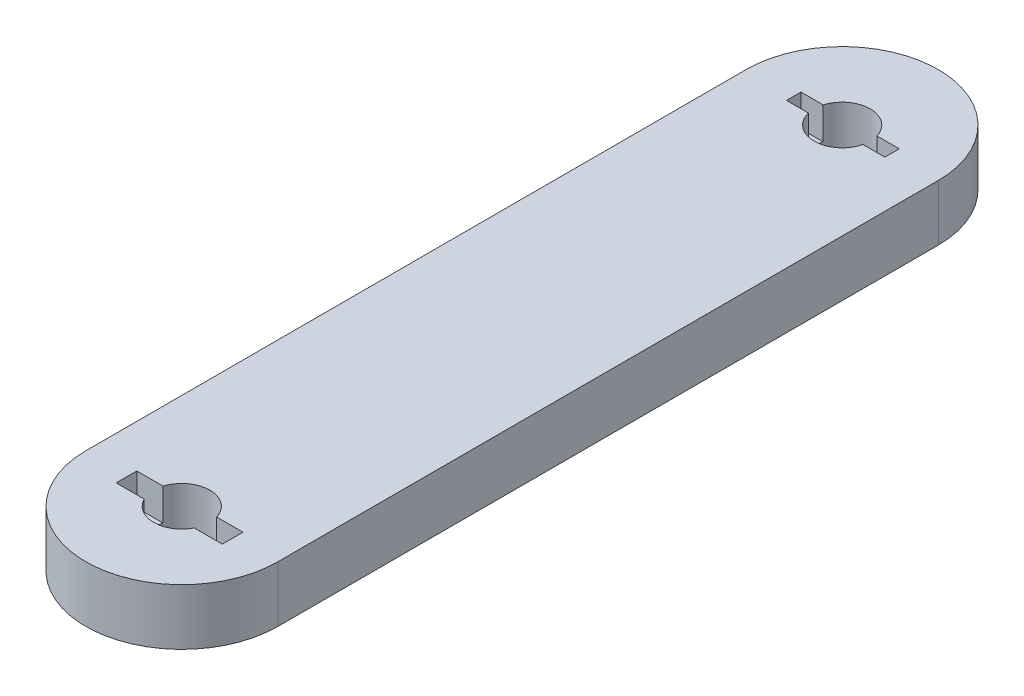
ISO-10303-21;
HEADER;
FILE_DESCRIPTION(('STEP AP214'),'2;1');
FILE_NAME('part.step','',(''),(''),'','','');
FILE_SCHEMA(('AUTOMOTIVE_DESIGN { 1 0 10303 214 1 1 1 1 }'));
ENDSEC;
DATA;
#1=APPLICATION_CONTEXT('core data for automotive mechanical design processes');
#2=APPLICATION_PROTOCOL_DEFINITION('international standard','automotive_design',2000,#1);
#3=PRODUCT_CONTEXT('',#1,'mechanical');
#4=PRODUCT('Part','Part','',(#3));
#5=PRODUCT_RELATED_PRODUCT_CATEGORY('part','',(#4));
#6=PRODUCT_DEFINITION_FORMATION('','',#4);
#7=PRODUCT_DEFINITION_CONTEXT('part definition',#1,'design');
#8=PRODUCT_DEFINITION('design','',#6,#7);
#9=PRODUCT_DEFINITION_SHAPE('','',#8);
#10=(LENGTH_UNIT() NAMED_UNIT(*) SI_UNIT(.MILLI.,.METRE.));
#11=(NAMED_UNIT(*) PLANE_ANGLE_UNIT() SI_UNIT($,.RADIAN.));
#12=(NAMED_UNIT(*) SI_UNIT($,.STERADIAN.) SOLID_ANGLE_UNIT());
#13=UNCERTAINTY_MEASURE_WITH_UNIT(LENGTH_MEASURE(1.E-05),#10,'distance_accuracy_value','');
#14=(GEOMETRIC_REPRESENTATION_CONTEXT(3) GLOBAL_UNCERTAINTY_ASSIGNED_CONTEXT((#13)) GLOBAL_UNIT_ASSIGNED_CONTEXT((#10,
#11,#12)) REPRESENTATION_CONTEXT('',''));
#15=CARTESIAN_POINT('',(0.,0.,0.));
#16=DIRECTION('',(0.,0.,1.));
#17=DIRECTION('',(1.,0.,0.));
#18=AXIS2_PLACEMENT_3D('',#15,#16,#17);
#19=CARTESIAN_POINT('',(0.,7.,-41.25));
#20=DIRECTION('',(0.,1.,0.));
#21=DIRECTION('',(0.,0.,1.));
#22=AXIS2_PLACEMENT_3D('',#19,#20,#21);
#23=PLANE('',#22);
#24=DIRECTION('',(-1.,0.,0.));
#25=VECTOR('',#24,1.);
#26=CARTESIAN_POINT('',(-6.63281125319149,7.,40.2329530805697));
#27=LINE('',#26,#25);
#28=CARTESIAN_POINT('',(-3.3489723145582,7.,40.2329530805697));
#29=VERTEX_POINT('',#28);
#30=CARTESIAN_POINT('',(-6.63281125319149,7.,40.2329530805697));
#31=VERTEX_POINT('',#30);
#32=EDGE_CURVE('E197',#29,#31,#27,.T.);
#33=ORIENTED_EDGE('',*,*,#32,.F.);
#34=CARTESIAN_POINT('',(0.,7.,41.25));
#35=DIRECTION('',(0.,1.,0.));
#36=DIRECTION('',(0.,0.,1.));
#37=AXIS2_PLACEMENT_3D('',#34,#35,#36);
#38=CIRCLE('',#37,3.5);
#39=CARTESIAN_POINT('',(3.34897231455819,7.,40.2329530805697));
#40=VERTEX_POINT('',#39);
#41=EDGE_CURVE('E259',#40,#29,#38,.T.);
#42=ORIENTED_EDGE('',*,*,#41,.F.);
#43=CARTESIAN_POINT('',(6.62393199011865,7.,40.2329530805697));
#44=VERTEX_POINT('',#43);
#45=EDGE_CURVE('E195',#44,#40,#27,.T.);
#46=ORIENTED_EDGE('',*,*,#45,.F.);
#47=DIRECTION('',(0.,0.,-1.));
#48=VECTOR('',#47,1.);
#49=CARTESIAN_POINT('',(6.62393199011865,7.,40.2329530805697));
#50=LINE('',#49,#48);
#51=CARTESIAN_POINT('',(6.62393199011865,7.,42.8139119420991));
#52=VERTEX_POINT('',#51);
#53=EDGE_CURVE('E207',#52,#44,#50,.T.);
#54=ORIENTED_EDGE('',*,*,#53,.F.);
#55=DIRECTION('',(1.,0.,0.));
#56=VECTOR('',#55,1.);
#57=CARTESIAN_POINT('',(-6.63281125319149,7.,42.8139119420991));
#58=LINE('',#57,#56);
#59=CARTESIAN_POINT('',(3.13116263348934,7.,42.8139119420991));
#60=VERTEX_POINT('',#59);
#61=EDGE_CURVE('E203',#60,#52,#58,.T.);
#62=ORIENTED_EDGE('',*,*,#61,.F.);
#63=CARTESIAN_POINT('',(-3.13116263348934,7.,42.8139119420991));
#64=VERTEX_POINT('',#63);
#65=EDGE_CURVE('E256',#64,#60,#38,.T.);
#66=ORIENTED_EDGE('',*,*,#65,.F.);
#67=CARTESIAN_POINT('',(-6.63281125319149,7.,42.8139119420991));
#68=VERTEX_POINT('',#67);
#69=EDGE_CURVE('E205',#68,#64,#58,.T.);
#70=ORIENTED_EDGE('',*,*,#69,.F.);
#71=DIRECTION('',(0.,0.,1.));
#72=VECTOR('',#71,1.);
#73=CARTESIAN_POINT('',(-6.63281125319149,7.,40.2329530805697));
#74=LINE('',#73,#72);
#75=EDGE_CURVE('E179',#31,#68,#74,.T.);
#76=ORIENTED_EDGE('',*,*,#75,.F.);
#77=EDGE_LOOP('',(#33,#42,#46,#54,#62,#66,#70,#76));
#78=FACE_BOUND('',#77,.T.);
#79=DIRECTION('',(-1.,0.,0.));
#80=VECTOR('',#79,1.);
#81=CARTESIAN_POINT('',(-6.13831753886213,7.,-42.2358504559696));
#82=LINE('',#81,#80);
#83=CARTESIAN_POINT('',(-3.35828808747323,7.,-42.2358504559696));
#84=VERTEX_POINT('',#83);
#85=CARTESIAN_POINT('',(-6.13831753886213,7.,-42.2358504559696));
#86=VERTEX_POINT('',#85);
#87=EDGE_CURVE('E231',#84,#86,#82,.T.);
#88=ORIENTED_EDGE('',*,*,#87,.F.);
#89=CARTESIAN_POINT('',(0.,7.,-41.25));
#90=DIRECTION('',(0.,1.,0.));
#91=DIRECTION('',(0.,0.,1.));
#92=AXIS2_PLACEMENT_3D('',#89,#90,#91);
#93=CIRCLE('',#92,3.5);
#94=CARTESIAN_POINT('',(3.35828808747321,7.,-42.2358504559696));
#95=VERTEX_POINT('',#94);
#96=EDGE_CURVE('E253',#95,#84,#93,.T.);
#97=ORIENTED_EDGE('',*,*,#96,.F.);
#98=CARTESIAN_POINT('',(6.13831753886212,7.,-42.2358504559696));
#99=VERTEX_POINT('',#98);
#100=EDGE_CURVE('E228',#99,#95,#82,.T.);
#101=ORIENTED_EDGE('',*,*,#100,.F.);
#102=DIRECTION('',(0.,0.,-1.));
#103=VECTOR('',#102,1.);
#104=CARTESIAN_POINT('',(6.13831753886212,7.,-42.2358504559696));
#105=LINE('',#104,#103);
#106=CARTESIAN_POINT('',(6.13831753886212,7.,-40.4358504559696));
#107=VERTEX_POINT('',#106);
#108=EDGE_CURVE('E230',#107,#99,#105,.T.);
#109=ORIENTED_EDGE('',*,*,#108,.F.);
#110=DIRECTION('',(1.,0.,0.));
#111=VECTOR('',#110,1.);
#112=CARTESIAN_POINT('',(-6.13831753886213,7.,-40.4358504559696));
#113=LINE('',#112,#111);
#114=CARTESIAN_POINT('',(3.40399185074745,7.,-40.4358504559696));
#115=VERTEX_POINT('',#114);
#116=EDGE_CURVE('E234',#115,#107,#113,.T.);
#117=ORIENTED_EDGE('',*,*,#116,.F.);
#118=CARTESIAN_POINT('',(-3.40399185074747,7.,-40.4358504559696));
#119=VERTEX_POINT('',#118);
#120=EDGE_CURVE('E250',#119,#115,#93,.T.);
#121=ORIENTED_EDGE('',*,*,#120,.F.);
#122=CARTESIAN_POINT('',(-6.13831753886213,7.,-40.4358504559696));
#123=VERTEX_POINT('',#122);
#124=EDGE_CURVE('E235',#123,#119,#113,.T.);
#125=ORIENTED_EDGE('',*,*,#124,.F.);
#126=DIRECTION('',(0.,0.,1.));
#127=VECTOR('',#126,1.);
#128=CARTESIAN_POINT('',(-6.13831753886213,7.,-42.2358504559696));
#129=LINE('',#128,#127);
#130=EDGE_CURVE('E204',#86,#123,#129,.T.);
#131=ORIENTED_EDGE('',*,*,#130,.F.);
#132=EDGE_LOOP('',(#88,#97,#101,#109,#117,#121,#125,#131));
#133=FACE_BOUND('',#132,.T.);
#134=CARTESIAN_POINT('',(0.,7.,-41.25));
#135=DIRECTION('',(0.,1.,0.));
#136=DIRECTION('',(0.,0.,1.));
#137=AXIS2_PLACEMENT_3D('',#134,#135,#136);
#138=CIRCLE('',#137,12.);
#139=CARTESIAN_POINT('',(12.,7.,-41.25));
#140=VERTEX_POINT('',#139);
#141=CARTESIAN_POINT('',(-12.,7.,-41.25));
#142=VERTEX_POINT('',#141);
#143=EDGE_CURVE('E263',#140,#142,#138,.T.);
#144=ORIENTED_EDGE('',*,*,#143,.T.);
#145=DIRECTION('',(0.,0.,1.));
#146=VECTOR('',#145,1.);
#147=CARTESIAN_POINT('',(-12.,7.,-41.25));
#148=LINE('',#147,#146);
#149=CARTESIAN_POINT('',(-12.,7.,41.25));
#150=VERTEX_POINT('',#149);
#151=EDGE_CURVE('E266',#142,#150,#148,.T.);
#152=ORIENTED_EDGE('',*,*,#151,.T.);
#153=CARTESIAN_POINT('',(0.,7.,41.25));
#154=DIRECTION('',(0.,1.,0.));
#155=DIRECTION('',(0.,0.,1.));
#156=AXIS2_PLACEMENT_3D('',#153,#154,#155);
#157=CIRCLE('',#156,12.);
#158=CARTESIAN_POINT('',(12.,7.,41.25));
#159=VERTEX_POINT('',#158);
#160=EDGE_CURVE('E269',#150,#159,#157,.T.);
#161=ORIENTED_EDGE('',*,*,#160,.T.);
#162=DIRECTION('',(0.,0.,-1.));
#163=VECTOR('',#162,1.);
#164=CARTESIAN_POINT('',(12.,7.,-41.25));
#165=LINE('',#164,#163);
#166=EDGE_CURVE('E271',#159,#140,#165,.T.);
#167=ORIENTED_EDGE('',*,*,#166,.T.);
#168=EDGE_LOOP('',(#144,#152,#161,#167));
#169=FACE_BOUND('',#168,.T.);
#170=ADVANCED_FACE('F36',(#78,#133,#169),#23,.T.);
#171=CARTESIAN_POINT('',(0.,0.,-41.25));
#172=DIRECTION('',(0.,1.,0.));
#173=DIRECTION('',(0.,0.,1.));
#174=AXIS2_PLACEMENT_3D('',#171,#172,#173);
#175=PLANE('',#174);
#176=CARTESIAN_POINT('',(0.,0.,-41.25));
#177=DIRECTION('',(0.,1.,0.));
#178=DIRECTION('',(0.,0.,1.));
#179=AXIS2_PLACEMENT_3D('',#176,#177,#178);
#180=CIRCLE('',#179,12.);
#181=CARTESIAN_POINT('',(12.,0.,-41.25));
#182=VERTEX_POINT('',#181);
#183=CARTESIAN_POINT('',(-12.,0.,-41.25));
#184=VERTEX_POINT('',#183);
#185=EDGE_CURVE('E274',#182,#184,#180,.T.);
#186=ORIENTED_EDGE('',*,*,#185,.F.);
#187=DIRECTION('',(0.,0.,-1.));
#188=VECTOR('',#187,1.);
#189=CARTESIAN_POINT('',(12.,0.,-41.25));
#190=LINE('',#189,#188);
#191=CARTESIAN_POINT('',(12.,0.,41.25));
#192=VERTEX_POINT('',#191);
#193=EDGE_CURVE('E267',#192,#182,#190,.T.);
#194=ORIENTED_EDGE('',*,*,#193,.F.);
#195=CARTESIAN_POINT('',(0.,0.,41.25));
#196=DIRECTION('',(0.,1.,0.));
#197=DIRECTION('',(0.,0.,1.));
#198=AXIS2_PLACEMENT_3D('',#195,#196,#197);
#199=CIRCLE('',#198,12.);
#200=CARTESIAN_POINT('',(-12.,0.,41.25));
#201=VERTEX_POINT('',#200);
#202=EDGE_CURVE('E279',#201,#192,#199,.T.);
#203=ORIENTED_EDGE('',*,*,#202,.F.);
#204=DIRECTION('',(0.,0.,1.));
#205=VECTOR('',#204,1.);
#206=CARTESIAN_POINT('',(-12.,0.,-41.25));
#207=LINE('',#206,#205);
#208=EDGE_CURVE('E277',#184,#201,#207,.T.);
#209=ORIENTED_EDGE('',*,*,#208,.F.);
#210=EDGE_LOOP('',(#186,#194,#203,#209));
#211=FACE_BOUND('',#210,.T.);
#212=CARTESIAN_POINT('',(0.,0.,41.25));
#213=DIRECTION('',(0.,1.,0.));
#214=DIRECTION('',(0.,0.,1.));
#215=AXIS2_PLACEMENT_3D('',#212,#213,#214);
#216=CIRCLE('',#215,3.5);
#217=CARTESIAN_POINT('',(0.,0.,44.75));
#218=VERTEX_POINT('',#217);
#219=EDGE_CURVE('E260',#218,#218,#216,.T.);
#220=ORIENTED_EDGE('',*,*,#219,.T.);
#221=EDGE_LOOP('',(#220));
#222=FACE_BOUND('',#221,.T.);
#223=CARTESIAN_POINT('',(0.,0.,-41.25));
#224=DIRECTION('',(0.,1.,0.));
#225=DIRECTION('',(0.,0.,1.));
#226=AXIS2_PLACEMENT_3D('',#223,#224,#225);
#227=CIRCLE('',#226,3.5);
#228=CARTESIAN_POINT('',(0.,0.,-37.75));
#229=VERTEX_POINT('',#228);
#230=EDGE_CURVE('E212',#229,#229,#227,.T.);
#231=ORIENTED_EDGE('',*,*,#230,.T.);
#232=EDGE_LOOP('',(#231));
#233=FACE_BOUND('',#232,.T.);
#234=ADVANCED_FACE('F352',(#211,#222,#233),#175,.F.);
#235=CARTESIAN_POINT('',(0.,7.,-41.25));
#236=DIRECTION('',(0.,-1.,0.));
#237=DIRECTION('',(0.,0.,-1.));
#238=AXIS2_PLACEMENT_3D('',#235,#236,#237);
#239=CYLINDRICAL_SURFACE('',#238,12.);
#240=ORIENTED_EDGE('',*,*,#185,.T.);
#241=DIRECTION('',(0.,-1.,0.));
#242=VECTOR('',#241,1.);
#243=CARTESIAN_POINT('',(-12.,7.,-41.25));
#244=LINE('',#243,#242);
#245=EDGE_CURVE('E290',#142,#184,#244,.T.);
#246=ORIENTED_EDGE('',*,*,#245,.F.);
#247=ORIENTED_EDGE('',*,*,#143,.F.);
#248=DIRECTION('',(0.,-1.,0.));
#249=VECTOR('',#248,1.);
#250=CARTESIAN_POINT('',(12.,7.,-41.25));
#251=LINE('',#250,#249);
#252=EDGE_CURVE('E273',#140,#182,#251,.T.);
#253=ORIENTED_EDGE('',*,*,#252,.T.);
#254=EDGE_LOOP('',(#240,#246,#247,#253));
#255=FACE_BOUND('',#254,.T.);
#256=ADVANCED_FACE('F38',(#255),#239,.T.);
#257=CARTESIAN_POINT('',(-12.,7.,-41.25));
#258=DIRECTION('',(1.,0.,0.));
#259=DIRECTION('',(0.,0.,-1.));
#260=AXIS2_PLACEMENT_3D('',#257,#258,#259);
#261=PLANE('',#260);
#262=ORIENTED_EDGE('',*,*,#208,.T.);
#263=DIRECTION('',(0.,-1.,0.));
#264=VECTOR('',#263,1.);
#265=CARTESIAN_POINT('',(-12.,7.,41.25));
#266=LINE('',#265,#264);
#267=EDGE_CURVE('E287',#150,#201,#266,.T.);
#268=ORIENTED_EDGE('',*,*,#267,.F.);
#269=ORIENTED_EDGE('',*,*,#151,.F.);
#270=ORIENTED_EDGE('',*,*,#245,.T.);
#271=EDGE_LOOP('',(#262,#268,#269,#270));
#272=FACE_BOUND('',#271,.T.);
#273=ADVANCED_FACE('F368',(#272),#261,.F.);
#274=CARTESIAN_POINT('',(0.,7.,41.25));
#275=DIRECTION('',(0.,-1.,0.));
#276=DIRECTION('',(0.,0.,-1.));
#277=AXIS2_PLACEMENT_3D('',#274,#275,#276);
#278=CYLINDRICAL_SURFACE('',#277,12.);
#279=ORIENTED_EDGE('',*,*,#202,.T.);
#280=DIRECTION('',(0.,-1.,0.));
#281=VECTOR('',#280,1.);
#282=CARTESIAN_POINT('',(12.,7.,41.25));
#283=LINE('',#282,#281);
#284=EDGE_CURVE('E284',#159,#192,#283,.T.);
#285=ORIENTED_EDGE('',*,*,#284,.F.);
#286=ORIENTED_EDGE('',*,*,#160,.F.);
#287=ORIENTED_EDGE('',*,*,#267,.T.);
#288=EDGE_LOOP('',(#279,#285,#286,#287));
#289=FACE_BOUND('',#288,.T.);
#290=ADVANCED_FACE('F365',(#289),#278,.T.);
#291=CARTESIAN_POINT('',(12.,7.,-41.25));
#292=DIRECTION('',(-1.,0.,0.));
#293=DIRECTION('',(0.,0.,1.));
#294=AXIS2_PLACEMENT_3D('',#291,#292,#293);
#295=PLANE('',#294);
#296=ORIENTED_EDGE('',*,*,#193,.T.);
#297=ORIENTED_EDGE('',*,*,#252,.F.);
#298=ORIENTED_EDGE('',*,*,#166,.F.);
#299=ORIENTED_EDGE('',*,*,#284,.T.);
#300=EDGE_LOOP('',(#296,#297,#298,#299));
#301=FACE_BOUND('',#300,.T.);
#302=ADVANCED_FACE('F362',(#301),#295,.F.);
#303=CARTESIAN_POINT('',(0.,7.,41.25));
#304=DIRECTION('',(0.,-1.,0.));
#305=DIRECTION('',(0.,0.,-1.));
#306=AXIS2_PLACEMENT_3D('',#303,#304,#305);
#307=CYLINDRICAL_SURFACE('',#306,3.5);
#308=DIRECTION('',(0.,-1.,0.));
#309=VECTOR('',#308,1.);
#310=CARTESIAN_POINT('',(3.34897231455819,7.,40.2329530805697));
#311=LINE('',#310,#309);
#312=CARTESIAN_POINT('',(3.34897231455819,3.,40.2329530805697));
#313=VERTEX_POINT('',#312);
#314=EDGE_CURVE('E11',#40,#313,#311,.T.);
#315=ORIENTED_EDGE('',*,*,#314,.F.);
#316=ORIENTED_EDGE('',*,*,#41,.T.);
#317=DIRECTION('',(0.,-1.,0.));
#318=VECTOR('',#317,1.);
#319=CARTESIAN_POINT('',(-3.3489723145582,7.,40.2329530805697));
#320=LINE('',#319,#318);
#321=CARTESIAN_POINT('',(-3.3489723145582,3.,40.2329530805697));
#322=VERTEX_POINT('',#321);
#323=EDGE_CURVE('E311',#322,#29,#320,.F.);
#324=ORIENTED_EDGE('',*,*,#323,.F.);
#325=CARTESIAN_POINT('',(0.,3.,41.25));
#326=DIRECTION('',(0.,1.,0.));
#327=DIRECTION('',(0.,0.,1.));
#328=AXIS2_PLACEMENT_3D('',#325,#326,#327);
#329=CIRCLE('',#328,3.5);
#330=CARTESIAN_POINT('',(-3.13116263348934,3.,42.8139119420991));
#331=VERTEX_POINT('',#330);
#332=EDGE_CURVE('E307',#322,#331,#329,.T.);
#333=ORIENTED_EDGE('',*,*,#332,.T.);
#334=DIRECTION('',(0.,-1.,0.));
#335=VECTOR('',#334,1.);
#336=CARTESIAN_POINT('',(-3.13116263348934,7.,42.8139119420991));
#337=LINE('',#336,#335);
#338=EDGE_CURVE('E186',#64,#331,#337,.T.);
#339=ORIENTED_EDGE('',*,*,#338,.F.);
#340=ORIENTED_EDGE('',*,*,#65,.T.);
#341=DIRECTION('',(0.,-1.,0.));
#342=VECTOR('',#341,1.);
#343=CARTESIAN_POINT('',(3.13116263348934,7.,42.8139119420991));
#344=LINE('',#343,#342);
#345=CARTESIAN_POINT('',(3.13116263348934,3.,42.8139119420991));
#346=VERTEX_POINT('',#345);
#347=EDGE_CURVE('E44',#346,#60,#344,.F.);
#348=ORIENTED_EDGE('',*,*,#347,.F.);
#349=EDGE_CURVE('E309',#346,#313,#329,.T.);
#350=ORIENTED_EDGE('',*,*,#349,.T.);
#351=EDGE_LOOP('',(#315,#316,#324,#333,#339,#340,#348,#350));
#352=FACE_BOUND('',#351,.T.);
#353=ORIENTED_EDGE('',*,*,#219,.F.);
#354=EDGE_LOOP('',(#353));
#355=FACE_BOUND('',#354,.T.);
#356=ADVANCED_FACE('F319',(#352,#355),#307,.F.);
#357=CARTESIAN_POINT('',(0.,7.,-41.25));
#358=DIRECTION('',(0.,-1.,0.));
#359=DIRECTION('',(0.,0.,-1.));
#360=AXIS2_PLACEMENT_3D('',#357,#358,#359);
#361=CYLINDRICAL_SURFACE('',#360,3.5);
#362=DIRECTION('',(0.,-1.,0.));
#363=VECTOR('',#362,1.);
#364=CARTESIAN_POINT('',(3.35828808747321,7.,-42.2358504559696));
#365=LINE('',#364,#363);
#366=CARTESIAN_POINT('',(3.35828808747321,3.,-42.2358504559696));
#367=VERTEX_POINT('',#366);
#368=EDGE_CURVE('E304',#95,#367,#365,.T.);
#369=ORIENTED_EDGE('',*,*,#368,.F.);
#370=ORIENTED_EDGE('',*,*,#96,.T.);
#371=DIRECTION('',(0.,-1.,0.));
#372=VECTOR('',#371,1.);
#373=CARTESIAN_POINT('',(-3.35828808747323,7.,-42.2358504559696));
#374=LINE('',#373,#372);
#375=CARTESIAN_POINT('',(-3.35828808747323,3.,-42.2358504559696));
#376=VERTEX_POINT('',#375);
#377=EDGE_CURVE('E300',#376,#84,#374,.F.);
#378=ORIENTED_EDGE('',*,*,#377,.F.);
#379=CARTESIAN_POINT('',(0.,3.,-41.25));
#380=DIRECTION('',(0.,1.,0.));
#381=DIRECTION('',(0.,0.,1.));
#382=AXIS2_PLACEMENT_3D('',#379,#380,#381);
#383=CIRCLE('',#382,3.5);
#384=CARTESIAN_POINT('',(-3.40399185074747,3.,-40.4358504559696));
#385=VERTEX_POINT('',#384);
#386=EDGE_CURVE('E293',#376,#385,#383,.T.);
#387=ORIENTED_EDGE('',*,*,#386,.T.);
#388=DIRECTION('',(0.,-1.,0.));
#389=VECTOR('',#388,1.);
#390=CARTESIAN_POINT('',(-3.40399185074747,7.,-40.4358504559696));
#391=LINE('',#390,#389);
#392=EDGE_CURVE('E296',#119,#385,#391,.T.);
#393=ORIENTED_EDGE('',*,*,#392,.F.);
#394=ORIENTED_EDGE('',*,*,#120,.T.);
#395=DIRECTION('',(0.,-1.,0.));
#396=VECTOR('',#395,1.);
#397=CARTESIAN_POINT('',(3.40399185074745,7.,-40.4358504559696));
#398=LINE('',#397,#396);
#399=CARTESIAN_POINT('',(3.40399185074745,3.,-40.4358504559696));
#400=VERTEX_POINT('',#399);
#401=EDGE_CURVE('E302',#400,#115,#398,.F.);
#402=ORIENTED_EDGE('',*,*,#401,.F.);
#403=EDGE_CURVE('E297',#400,#367,#383,.T.);
#404=ORIENTED_EDGE('',*,*,#403,.T.);
#405=EDGE_LOOP('',(#369,#370,#378,#387,#393,#394,#402,#404));
#406=FACE_BOUND('',#405,.T.);
#407=ORIENTED_EDGE('',*,*,#230,.F.);
#408=EDGE_LOOP('',(#407));
#409=FACE_BOUND('',#408,.T.);
#410=ADVANCED_FACE('F392',(#406,#409),#361,.F.);
#411=CARTESIAN_POINT('',(0.,3.,0.));
#412=DIRECTION('',(0.,1.,0.));
#413=DIRECTION('',(0.,0.,1.));
#414=AXIS2_PLACEMENT_3D('',#411,#412,#413);
#415=PLANE('',#414);
#416=DIRECTION('',(-1.,0.,0.));
#417=VECTOR('',#416,1.);
#418=CARTESIAN_POINT('',(-6.13831753886213,3.,-42.2358504559696));
#419=LINE('',#418,#417);
#420=CARTESIAN_POINT('',(-6.13831753886213,3.,-42.2358504559696));
#421=VERTEX_POINT('',#420);
#422=EDGE_CURVE('E219',#376,#421,#419,.T.);
#423=ORIENTED_EDGE('',*,*,#422,.T.);
#424=DIRECTION('',(0.,0.,1.));
#425=VECTOR('',#424,1.);
#426=CARTESIAN_POINT('',(-6.13831753886213,3.,-42.2358504559696));
#427=LINE('',#426,#425);
#428=CARTESIAN_POINT('',(-6.13831753886213,3.,-40.4358504559696));
#429=VERTEX_POINT('',#428);
#430=EDGE_CURVE('E247',#421,#429,#427,.T.);
#431=ORIENTED_EDGE('',*,*,#430,.T.);
#432=DIRECTION('',(1.,0.,0.));
#433=VECTOR('',#432,1.);
#434=CARTESIAN_POINT('',(-6.13831753886213,3.,-40.4358504559696));
#435=LINE('',#434,#433);
#436=EDGE_CURVE('E245',#429,#385,#435,.T.);
#437=ORIENTED_EDGE('',*,*,#436,.T.);
#438=ORIENTED_EDGE('',*,*,#386,.F.);
#439=EDGE_LOOP('',(#423,#431,#437,#438));
#440=FACE_BOUND('',#439,.T.);
#441=ADVANCED_FACE('F394',(#440),#415,.T.);
#442=CARTESIAN_POINT('',(-6.13831753886213,3.,-40.4358504559696));
#443=DIRECTION('',(0.,0.,1.));
#444=DIRECTION('',(1.,0.,0.));
#445=AXIS2_PLACEMENT_3D('',#442,#443,#444);
#446=PLANE('',#445);
#447=ORIENTED_EDGE('',*,*,#392,.T.);
#448=ORIENTED_EDGE('',*,*,#436,.F.);
#449=DIRECTION('',(0.,1.,0.));
#450=VECTOR('',#449,1.);
#451=CARTESIAN_POINT('',(-6.13831753886213,3.,-40.4358504559696));
#452=LINE('',#451,#450);
#453=EDGE_CURVE('E217',#429,#123,#452,.T.);
#454=ORIENTED_EDGE('',*,*,#453,.T.);
#455=ORIENTED_EDGE('',*,*,#124,.T.);
#456=EDGE_LOOP('',(#447,#448,#454,#455));
#457=FACE_BOUND('',#456,.T.);
#458=ADVANCED_FACE('F400',(#457),#446,.F.);
#459=CARTESIAN_POINT('',(-6.13831753886213,3.,-42.2358504559696));
#460=DIRECTION('',(0.,0.,-1.));
#461=DIRECTION('',(-1.,0.,0.));
#462=AXIS2_PLACEMENT_3D('',#459,#460,#461);
#463=PLANE('',#462);
#464=ORIENTED_EDGE('',*,*,#377,.T.);
#465=ORIENTED_EDGE('',*,*,#87,.T.);
#466=DIRECTION('',(0.,1.,0.));
#467=VECTOR('',#466,1.);
#468=CARTESIAN_POINT('',(-6.13831753886213,3.,-42.2358504559696));
#469=LINE('',#468,#467);
#470=EDGE_CURVE('E225',#421,#86,#469,.T.);
#471=ORIENTED_EDGE('',*,*,#470,.F.);
#472=ORIENTED_EDGE('',*,*,#422,.F.);
#473=EDGE_LOOP('',(#464,#465,#471,#472));
#474=FACE_BOUND('',#473,.T.);
#475=ADVANCED_FACE('F406',(#474),#463,.F.);
#476=CARTESIAN_POINT('',(-6.13831753886213,3.,-42.2358504559696));
#477=DIRECTION('',(-1.,0.,0.));
#478=DIRECTION('',(0.,0.,1.));
#479=AXIS2_PLACEMENT_3D('',#476,#477,#478);
#480=PLANE('',#479);
#481=ORIENTED_EDGE('',*,*,#130,.T.);
#482=ORIENTED_EDGE('',*,*,#453,.F.);
#483=ORIENTED_EDGE('',*,*,#430,.F.);
#484=ORIENTED_EDGE('',*,*,#470,.T.);
#485=EDGE_LOOP('',(#481,#482,#483,#484));
#486=FACE_BOUND('',#485,.T.);
#487=ADVANCED_FACE('F409',(#486),#480,.F.);
#488=ORIENTED_EDGE('',*,*,#368,.T.);
#489=CARTESIAN_POINT('',(6.13831753886212,3.,-42.2358504559696));
#490=VERTEX_POINT('',#489);
#491=EDGE_CURVE('E239',#490,#367,#419,.T.);
#492=ORIENTED_EDGE('',*,*,#491,.F.);
#493=DIRECTION('',(0.,1.,0.));
#494=VECTOR('',#493,1.);
#495=CARTESIAN_POINT('',(6.13831753886212,3.,-42.2358504559696));
#496=LINE('',#495,#494);
#497=EDGE_CURVE('E223',#490,#99,#496,.T.);
#498=ORIENTED_EDGE('',*,*,#497,.T.);
#499=ORIENTED_EDGE('',*,*,#100,.T.);
#500=EDGE_LOOP('',(#488,#492,#498,#499));
#501=FACE_BOUND('',#500,.T.);
#502=ADVANCED_FACE('F411',(#501),#463,.F.);
#503=CARTESIAN_POINT('',(6.13831753886212,3.,-40.4358504559696));
#504=VERTEX_POINT('',#503);
#505=EDGE_CURVE('E244',#400,#504,#435,.T.);
#506=ORIENTED_EDGE('',*,*,#505,.T.);
#507=DIRECTION('',(0.,0.,-1.));
#508=VECTOR('',#507,1.);
#509=CARTESIAN_POINT('',(6.13831753886212,3.,-42.2358504559696));
#510=LINE('',#509,#508);
#511=EDGE_CURVE('E241',#504,#490,#510,.T.);
#512=ORIENTED_EDGE('',*,*,#511,.T.);
#513=ORIENTED_EDGE('',*,*,#491,.T.);
#514=ORIENTED_EDGE('',*,*,#403,.F.);
#515=EDGE_LOOP('',(#506,#512,#513,#514));
#516=FACE_BOUND('',#515,.T.);
#517=ADVANCED_FACE('F403',(#516),#415,.T.);
#518=CARTESIAN_POINT('',(6.13831753886212,3.,-42.2358504559696));
#519=DIRECTION('',(1.,0.,0.));
#520=DIRECTION('',(0.,0.,-1.));
#521=AXIS2_PLACEMENT_3D('',#518,#519,#520);
#522=PLANE('',#521);
#523=ORIENTED_EDGE('',*,*,#108,.T.);
#524=ORIENTED_EDGE('',*,*,#497,.F.);
#525=ORIENTED_EDGE('',*,*,#511,.F.);
#526=DIRECTION('',(0.,1.,0.));
#527=VECTOR('',#526,1.);
#528=CARTESIAN_POINT('',(6.13831753886212,3.,-40.4358504559696));
#529=LINE('',#528,#527);
#530=EDGE_CURVE('E220',#504,#107,#529,.T.);
#531=ORIENTED_EDGE('',*,*,#530,.T.);
#532=EDGE_LOOP('',(#523,#524,#525,#531));
#533=FACE_BOUND('',#532,.T.);
#534=ADVANCED_FACE('F412',(#533),#522,.F.);
#535=ORIENTED_EDGE('',*,*,#401,.T.);
#536=ORIENTED_EDGE('',*,*,#116,.T.);
#537=ORIENTED_EDGE('',*,*,#530,.F.);
#538=ORIENTED_EDGE('',*,*,#505,.F.);
#539=EDGE_LOOP('',(#535,#536,#537,#538));
#540=FACE_BOUND('',#539,.T.);
#541=ADVANCED_FACE('F415',(#540),#446,.F.);
#542=CARTESIAN_POINT('',(0.,3.,0.));
#543=DIRECTION('',(0.,1.,0.));
#544=DIRECTION('',(0.,0.,1.));
#545=AXIS2_PLACEMENT_3D('',#542,#543,#544);
#546=PLANE('',#545);
#547=DIRECTION('',(-1.,0.,0.));
#548=VECTOR('',#547,1.);
#549=CARTESIAN_POINT('',(-6.63281125319149,3.,40.2329530805697));
#550=LINE('',#549,#548);
#551=CARTESIAN_POINT('',(-6.63281125319149,3.,40.2329530805697));
#552=VERTEX_POINT('',#551);
#553=EDGE_CURVE('E193',#322,#552,#550,.T.);
#554=ORIENTED_EDGE('',*,*,#553,.T.);
#555=DIRECTION('',(0.,0.,1.));
#556=VECTOR('',#555,1.);
#557=CARTESIAN_POINT('',(-6.63281125319149,3.,40.2329530805697));
#558=LINE('',#557,#556);
#559=CARTESIAN_POINT('',(-6.63281125319149,3.,42.8139119420991));
#560=VERTEX_POINT('',#559);
#561=EDGE_CURVE('E177',#552,#560,#558,.T.);
#562=ORIENTED_EDGE('',*,*,#561,.T.);
#563=DIRECTION('',(1.,0.,0.));
#564=VECTOR('',#563,1.);
#565=CARTESIAN_POINT('',(-6.63281125319149,3.,42.8139119420991));
#566=LINE('',#565,#564);
#567=EDGE_CURVE('E58',#560,#331,#566,.T.);
#568=ORIENTED_EDGE('',*,*,#567,.T.);
#569=ORIENTED_EDGE('',*,*,#332,.F.);
#570=EDGE_LOOP('',(#554,#562,#568,#569));
#571=FACE_BOUND('',#570,.T.);
#572=ADVANCED_FACE('F191',(#571),#546,.T.);
#573=CARTESIAN_POINT('',(-6.63281125319149,3.,42.8139119420991));
#574=DIRECTION('',(0.,0.,1.));
#575=DIRECTION('',(1.,0.,0.));
#576=AXIS2_PLACEMENT_3D('',#573,#574,#575);
#577=PLANE('',#576);
#578=ORIENTED_EDGE('',*,*,#338,.T.);
#579=ORIENTED_EDGE('',*,*,#567,.F.);
#580=DIRECTION('',(0.,1.,0.));
#581=VECTOR('',#580,1.);
#582=CARTESIAN_POINT('',(-6.63281125319149,3.,42.8139119420991));
#583=LINE('',#582,#581);
#584=EDGE_CURVE('E174',#560,#68,#583,.T.);
#585=ORIENTED_EDGE('',*,*,#584,.T.);
#586=ORIENTED_EDGE('',*,*,#69,.T.);
#587=EDGE_LOOP('',(#578,#579,#585,#586));
#588=FACE_BOUND('',#587,.T.);
#589=ADVANCED_FACE('F184',(#588),#577,.F.);
#590=CARTESIAN_POINT('',(-6.63281125319149,3.,40.2329530805697));
#591=DIRECTION('',(0.,0.,-1.));
#592=DIRECTION('',(-1.,0.,0.));
#593=AXIS2_PLACEMENT_3D('',#590,#591,#592);
#594=PLANE('',#593);
#595=ORIENTED_EDGE('',*,*,#323,.T.);
#596=ORIENTED_EDGE('',*,*,#32,.T.);
#597=DIRECTION('',(0.,1.,0.));
#598=VECTOR('',#597,1.);
#599=CARTESIAN_POINT('',(-6.63281125319149,3.,40.2329530805697));
#600=LINE('',#599,#598);
#601=EDGE_CURVE('E210',#552,#31,#600,.T.);
#602=ORIENTED_EDGE('',*,*,#601,.F.);
#603=ORIENTED_EDGE('',*,*,#553,.F.);
#604=EDGE_LOOP('',(#595,#596,#602,#603));
#605=FACE_BOUND('',#604,.T.);
#606=ADVANCED_FACE('F338',(#605),#594,.F.);
#607=CARTESIAN_POINT('',(-6.63281125319149,3.,40.2329530805697));
#608=DIRECTION('',(-1.,0.,0.));
#609=DIRECTION('',(0.,0.,1.));
#610=AXIS2_PLACEMENT_3D('',#607,#608,#609);
#611=PLANE('',#610);
#612=ORIENTED_EDGE('',*,*,#75,.T.);
#613=ORIENTED_EDGE('',*,*,#584,.F.);
#614=ORIENTED_EDGE('',*,*,#561,.F.);
#615=ORIENTED_EDGE('',*,*,#601,.T.);
#616=EDGE_LOOP('',(#612,#613,#614,#615));
#617=FACE_BOUND('',#616,.T.);
#618=ADVANCED_FACE('F175',(#617),#611,.F.);
#619=ORIENTED_EDGE('',*,*,#314,.T.);
#620=CARTESIAN_POINT('',(6.62393199011865,3.,40.2329530805697));
#621=VERTEX_POINT('',#620);
#622=EDGE_CURVE('E51',#621,#313,#550,.T.);
#623=ORIENTED_EDGE('',*,*,#622,.F.);
#624=DIRECTION('',(0.,1.,0.));
#625=VECTOR('',#624,1.);
#626=CARTESIAN_POINT('',(6.62393199011865,3.,40.2329530805697));
#627=LINE('',#626,#625);
#628=EDGE_CURVE('E213',#621,#44,#627,.T.);
#629=ORIENTED_EDGE('',*,*,#628,.T.);
#630=ORIENTED_EDGE('',*,*,#45,.T.);
#631=EDGE_LOOP('',(#619,#623,#629,#630));
#632=FACE_BOUND('',#631,.T.);
#633=ADVANCED_FACE('F331',(#632),#594,.F.);
#634=CARTESIAN_POINT('',(6.62393199011865,3.,42.8139119420991));
#635=VERTEX_POINT('',#634);
#636=EDGE_CURVE('E189',#346,#635,#566,.T.);
#637=ORIENTED_EDGE('',*,*,#636,.T.);
#638=DIRECTION('',(0.,0.,-1.));
#639=VECTOR('',#638,1.);
#640=CARTESIAN_POINT('',(6.62393199011865,3.,40.2329530805697));
#641=LINE('',#640,#639);
#642=EDGE_CURVE('E188',#635,#621,#641,.T.);
#643=ORIENTED_EDGE('',*,*,#642,.T.);
#644=ORIENTED_EDGE('',*,*,#622,.T.);
#645=ORIENTED_EDGE('',*,*,#349,.F.);
#646=EDGE_LOOP('',(#637,#643,#644,#645));
#647=FACE_BOUND('',#646,.T.);
#648=ADVANCED_FACE('F323',(#647),#546,.T.);
#649=CARTESIAN_POINT('',(6.62393199011865,3.,40.2329530805697));
#650=DIRECTION('',(1.,0.,0.));
#651=DIRECTION('',(0.,0.,-1.));
#652=AXIS2_PLACEMENT_3D('',#649,#650,#651);
#653=PLANE('',#652);
#654=ORIENTED_EDGE('',*,*,#53,.T.);
#655=ORIENTED_EDGE('',*,*,#628,.F.);
#656=ORIENTED_EDGE('',*,*,#642,.F.);
#657=DIRECTION('',(0.,1.,0.));
#658=VECTOR('',#657,1.);
#659=CARTESIAN_POINT('',(6.62393199011865,3.,42.8139119420991));
#660=LINE('',#659,#658);
#661=EDGE_CURVE('E182',#635,#52,#660,.T.);
#662=ORIENTED_EDGE('',*,*,#661,.T.);
#663=EDGE_LOOP('',(#654,#655,#656,#662));
#664=FACE_BOUND('',#663,.T.);
#665=ADVANCED_FACE('F329',(#664),#653,.F.);
#666=ORIENTED_EDGE('',*,*,#347,.T.);
#667=ORIENTED_EDGE('',*,*,#61,.T.);
#668=ORIENTED_EDGE('',*,*,#661,.F.);
#669=ORIENTED_EDGE('',*,*,#636,.F.);
#670=EDGE_LOOP('',(#666,#667,#668,#669));
#671=FACE_BOUND('',#670,.T.);
#672=ADVANCED_FACE('F325',(#671),#577,.F.);
#673=CLOSED_SHELL('',(#170,#234,#256,#273,#290,#302,#356,#410,#441,#458,#475,#487,#502,#517,
#534,#541,#572,#589,#606,#618,#633,#648,#665,#672));
#674=MANIFOLD_SOLID_BREP('B2',#673);
#675=ADVANCED_BREP_SHAPE_REPRESENTATION('',(#18,#674),#14);
#676=SHAPE_DEFINITION_REPRESENTATION(#9,#675);
ENDSEC;
END-ISO-10303-21;
